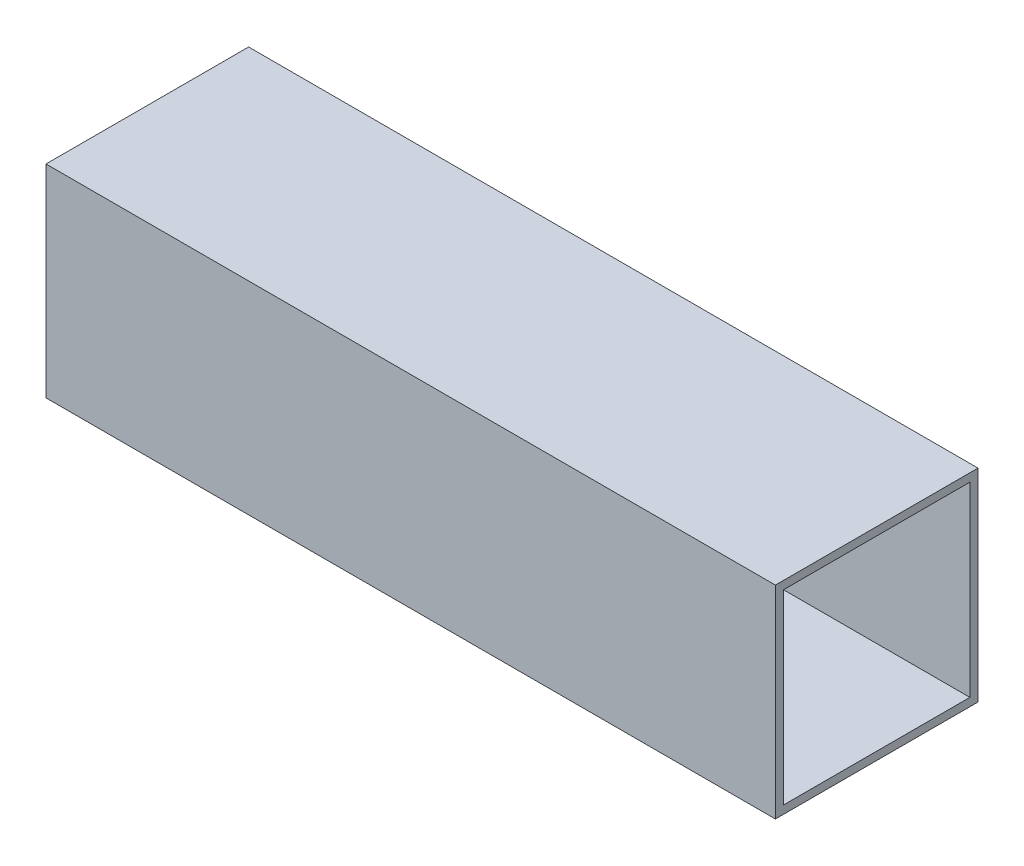
ISO-10303-21;
HEADER;
FILE_DESCRIPTION(('STEP AP214'),'2;1');
FILE_NAME('part.step','',(''),(''),'','','');
FILE_SCHEMA(('AUTOMOTIVE_DESIGN { 1 0 10303 214 1 1 1 1 }'));
ENDSEC;
DATA;
#1=APPLICATION_CONTEXT('core data for automotive mechanical design processes');
#2=APPLICATION_PROTOCOL_DEFINITION('international standard','automotive_design',2000,#1);
#3=PRODUCT_CONTEXT('',#1,'mechanical');
#4=PRODUCT('Part','Part','',(#3));
#5=PRODUCT_RELATED_PRODUCT_CATEGORY('part','',(#4));
#6=PRODUCT_DEFINITION_FORMATION('','',#4);
#7=PRODUCT_DEFINITION_CONTEXT('part definition',#1,'design');
#8=PRODUCT_DEFINITION('design','',#6,#7);
#9=PRODUCT_DEFINITION_SHAPE('','',#8);
#10=(LENGTH_UNIT() NAMED_UNIT(*) SI_UNIT(.MILLI.,.METRE.));
#11=(NAMED_UNIT(*) PLANE_ANGLE_UNIT() SI_UNIT($,.RADIAN.));
#12=(NAMED_UNIT(*) SI_UNIT($,.STERADIAN.) SOLID_ANGLE_UNIT());
#13=UNCERTAINTY_MEASURE_WITH_UNIT(LENGTH_MEASURE(1.E-05),#10,'distance_accuracy_value','');
#14=(GEOMETRIC_REPRESENTATION_CONTEXT(3) GLOBAL_UNCERTAINTY_ASSIGNED_CONTEXT((#13)) GLOBAL_UNIT_ASSIGNED_CONTEXT((#10,
#11,#12)) REPRESENTATION_CONTEXT('',''));
#15=CARTESIAN_POINT('',(0.,0.,0.));
#16=DIRECTION('',(0.,0.,1.));
#17=DIRECTION('',(1.,0.,0.));
#18=AXIS2_PLACEMENT_3D('',#15,#16,#17);
#19=CARTESIAN_POINT('',(0.,0.,25.));
#20=DIRECTION('',(1.,0.,0.));
#21=DIRECTION('',(0.,1.,0.));
#22=AXIS2_PLACEMENT_3D('',#19,#20,#21);
#23=PLANE('',#22);
#24=DIRECTION('',(0.,-1.,0.));
#25=VECTOR('',#24,1.);
#26=CARTESIAN_POINT('',(0.,0.,0.));
#27=LINE('',#26,#25);
#28=CARTESIAN_POINT('',(0.,0.,0.));
#29=VERTEX_POINT('',#28);
#30=CARTESIAN_POINT('',(0.,-25.,0.));
#31=VERTEX_POINT('',#30);
#32=EDGE_CURVE('E115',#29,#31,#27,.T.);
#33=ORIENTED_EDGE('',*,*,#32,.T.);
#34=DIRECTION('',(0.,0.,-1.));
#35=VECTOR('',#34,1.);
#36=CARTESIAN_POINT('',(0.,-25.,25.));
#37=LINE('',#36,#35);
#38=CARTESIAN_POINT('',(0.,-25.,25.));
#39=VERTEX_POINT('',#38);
#40=EDGE_CURVE('E11',#39,#31,#37,.T.);
#41=ORIENTED_EDGE('',*,*,#40,.F.);
#42=DIRECTION('',(0.,-1.,0.));
#43=VECTOR('',#42,1.);
#44=CARTESIAN_POINT('',(0.,0.,25.));
#45=LINE('',#44,#43);
#46=CARTESIAN_POINT('',(0.,0.,25.));
#47=VERTEX_POINT('',#46);
#48=EDGE_CURVE('E134',#47,#39,#45,.T.);
#49=ORIENTED_EDGE('',*,*,#48,.F.);
#50=DIRECTION('',(0.,0.,-1.));
#51=VECTOR('',#50,1.);
#52=CARTESIAN_POINT('',(0.,0.,25.));
#53=LINE('',#52,#51);
#54=EDGE_CURVE('E144',#47,#29,#53,.T.);
#55=ORIENTED_EDGE('',*,*,#54,.T.);
#56=EDGE_LOOP('',(#33,#41,#49,#55));
#57=FACE_BOUND('',#56,.T.);
#58=DIRECTION('',(0.,0.,-1.));
#59=VECTOR('',#58,1.);
#60=CARTESIAN_POINT('',(0.,-1.,24.));
#61=LINE('',#60,#59);
#62=CARTESIAN_POINT('',(0.,-1.,24.));
#63=VERTEX_POINT('',#62);
#64=CARTESIAN_POINT('',(0.,-1.,0.999999999999988));
#65=VERTEX_POINT('',#64);
#66=EDGE_CURVE('E98',#63,#65,#61,.T.);
#67=ORIENTED_EDGE('',*,*,#66,.F.);
#68=DIRECTION('',(0.,1.,0.));
#69=VECTOR('',#68,1.);
#70=CARTESIAN_POINT('',(0.,-24.,24.));
#71=LINE('',#70,#69);
#72=CARTESIAN_POINT('',(0.,-24.,24.));
#73=VERTEX_POINT('',#72);
#74=EDGE_CURVE('E119',#73,#63,#71,.T.);
#75=ORIENTED_EDGE('',*,*,#74,.F.);
#76=DIRECTION('',(0.,0.,-1.));
#77=VECTOR('',#76,1.);
#78=CARTESIAN_POINT('',(0.,-24.,24.));
#79=LINE('',#78,#77);
#80=CARTESIAN_POINT('',(0.,-24.,0.999999999999988));
#81=VERTEX_POINT('',#80);
#82=EDGE_CURVE('E49',#73,#81,#79,.T.);
#83=ORIENTED_EDGE('',*,*,#82,.T.);
#84=DIRECTION('',(0.,1.,0.));
#85=VECTOR('',#84,1.);
#86=CARTESIAN_POINT('',(0.,-24.,0.999999999999988));
#87=LINE('',#86,#85);
#88=EDGE_CURVE('E107',#81,#65,#87,.T.);
#89=ORIENTED_EDGE('',*,*,#88,.T.);
#90=EDGE_LOOP('',(#67,#75,#83,#89));
#91=FACE_BOUND('',#90,.T.);
#92=ADVANCED_FACE('F35',(#57,#91),#23,.F.);
#93=CARTESIAN_POINT('',(90.,0.,25.));
#94=DIRECTION('',(-1.,0.,0.));
#95=DIRECTION('',(0.,0.,1.));
#96=AXIS2_PLACEMENT_3D('',#93,#94,#95);
#97=PLANE('',#96);
#98=DIRECTION('',(0.,1.,0.));
#99=VECTOR('',#98,1.);
#100=CARTESIAN_POINT('',(90.,0.,0.));
#101=LINE('',#100,#99);
#102=CARTESIAN_POINT('',(90.,-25.,0.));
#103=VERTEX_POINT('',#102);
#104=CARTESIAN_POINT('',(90.,0.,0.));
#105=VERTEX_POINT('',#104);
#106=EDGE_CURVE('E149',#103,#105,#101,.T.);
#107=ORIENTED_EDGE('',*,*,#106,.T.);
#108=DIRECTION('',(0.,0.,-1.));
#109=VECTOR('',#108,1.);
#110=CARTESIAN_POINT('',(90.,0.,25.));
#111=LINE('',#110,#109);
#112=CARTESIAN_POINT('',(90.,0.,25.));
#113=VERTEX_POINT('',#112);
#114=EDGE_CURVE('E154',#113,#105,#111,.T.);
#115=ORIENTED_EDGE('',*,*,#114,.F.);
#116=DIRECTION('',(0.,1.,0.));
#117=VECTOR('',#116,1.);
#118=CARTESIAN_POINT('',(90.,0.,25.));
#119=LINE('',#118,#117);
#120=CARTESIAN_POINT('',(90.,-25.,25.));
#121=VERTEX_POINT('',#120);
#122=EDGE_CURVE('E140',#121,#113,#119,.T.);
#123=ORIENTED_EDGE('',*,*,#122,.F.);
#124=DIRECTION('',(0.,0.,-1.));
#125=VECTOR('',#124,1.);
#126=CARTESIAN_POINT('',(90.,-25.,25.));
#127=LINE('',#126,#125);
#128=EDGE_CURVE('E42',#121,#103,#127,.T.);
#129=ORIENTED_EDGE('',*,*,#128,.T.);
#130=EDGE_LOOP('',(#107,#115,#123,#129));
#131=FACE_BOUND('',#130,.T.);
#132=DIRECTION('',(0.,0.,-1.));
#133=VECTOR('',#132,1.);
#134=CARTESIAN_POINT('',(90.,-1.,24.));
#135=LINE('',#134,#133);
#136=CARTESIAN_POINT('',(90.,-1.,24.));
#137=VERTEX_POINT('',#136);
#138=CARTESIAN_POINT('',(90.,-1.,0.999999999999988));
#139=VERTEX_POINT('',#138);
#140=EDGE_CURVE('E57',#137,#139,#135,.T.);
#141=ORIENTED_EDGE('',*,*,#140,.T.);
#142=DIRECTION('',(0.,1.,0.));
#143=VECTOR('',#142,1.);
#144=CARTESIAN_POINT('',(90.,-24.,0.999999999999988));
#145=LINE('',#144,#143);
#146=CARTESIAN_POINT('',(90.,-24.,0.999999999999988));
#147=VERTEX_POINT('',#146);
#148=EDGE_CURVE('E114',#147,#139,#145,.T.);
#149=ORIENTED_EDGE('',*,*,#148,.F.);
#150=DIRECTION('',(0.,0.,-1.));
#151=VECTOR('',#150,1.);
#152=CARTESIAN_POINT('',(90.,-24.,24.));
#153=LINE('',#152,#151);
#154=CARTESIAN_POINT('',(90.,-24.,24.));
#155=VERTEX_POINT('',#154);
#156=EDGE_CURVE('E125',#155,#147,#153,.T.);
#157=ORIENTED_EDGE('',*,*,#156,.F.);
#158=DIRECTION('',(0.,1.,0.));
#159=VECTOR('',#158,1.);
#160=CARTESIAN_POINT('',(90.,-24.,24.));
#161=LINE('',#160,#159);
#162=EDGE_CURVE('E108',#155,#137,#161,.T.);
#163=ORIENTED_EDGE('',*,*,#162,.T.);
#164=EDGE_LOOP('',(#141,#149,#157,#163));
#165=FACE_BOUND('',#164,.T.);
#166=ADVANCED_FACE('F161',(#131,#165),#97,.F.);
#167=CARTESIAN_POINT('',(0.,-25.,25.));
#168=DIRECTION('',(0.,1.,0.));
#169=DIRECTION('',(0.,0.,1.));
#170=AXIS2_PLACEMENT_3D('',#167,#168,#169);
#171=PLANE('',#170);
#172=DIRECTION('',(1.,0.,0.));
#173=VECTOR('',#172,1.);
#174=CARTESIAN_POINT('',(0.,-25.,0.));
#175=LINE('',#174,#173);
#176=EDGE_CURVE('E147',#31,#103,#175,.T.);
#177=ORIENTED_EDGE('',*,*,#176,.T.);
#178=ORIENTED_EDGE('',*,*,#128,.F.);
#179=DIRECTION('',(1.,0.,0.));
#180=VECTOR('',#179,1.);
#181=CARTESIAN_POINT('',(0.,-25.,25.));
#182=LINE('',#181,#180);
#183=EDGE_CURVE('E137',#39,#121,#182,.T.);
#184=ORIENTED_EDGE('',*,*,#183,.F.);
#185=ORIENTED_EDGE('',*,*,#40,.T.);
#186=EDGE_LOOP('',(#177,#178,#184,#185));
#187=FACE_BOUND('',#186,.T.);
#188=ADVANCED_FACE('F178',(#187),#171,.F.);
#189=CARTESIAN_POINT('',(0.,0.,25.));
#190=DIRECTION('',(0.,-1.,0.));
#191=DIRECTION('',(0.,0.,-1.));
#192=AXIS2_PLACEMENT_3D('',#189,#190,#191);
#193=PLANE('',#192);
#194=DIRECTION('',(-1.,0.,0.));
#195=VECTOR('',#194,1.);
#196=CARTESIAN_POINT('',(0.,0.,0.));
#197=LINE('',#196,#195);
#198=EDGE_CURVE('E138',#105,#29,#197,.T.);
#199=ORIENTED_EDGE('',*,*,#198,.T.);
#200=ORIENTED_EDGE('',*,*,#54,.F.);
#201=DIRECTION('',(-1.,0.,0.));
#202=VECTOR('',#201,1.);
#203=CARTESIAN_POINT('',(0.,0.,25.));
#204=LINE('',#203,#202);
#205=EDGE_CURVE('E142',#113,#47,#204,.T.);
#206=ORIENTED_EDGE('',*,*,#205,.F.);
#207=ORIENTED_EDGE('',*,*,#114,.T.);
#208=EDGE_LOOP('',(#199,#200,#206,#207));
#209=FACE_BOUND('',#208,.T.);
#210=ADVANCED_FACE('F171',(#209),#193,.F.);
#211=CARTESIAN_POINT('',(0.,0.,25.));
#212=DIRECTION('',(0.,0.,1.));
#213=DIRECTION('',(1.,0.,0.));
#214=AXIS2_PLACEMENT_3D('',#211,#212,#213);
#215=PLANE('',#214);
#216=ORIENTED_EDGE('',*,*,#48,.T.);
#217=ORIENTED_EDGE('',*,*,#183,.T.);
#218=ORIENTED_EDGE('',*,*,#122,.T.);
#219=ORIENTED_EDGE('',*,*,#205,.T.);
#220=EDGE_LOOP('',(#216,#217,#218,#219));
#221=FACE_BOUND('',#220,.T.);
#222=ADVANCED_FACE('F177',(#221),#215,.T.);
#223=CARTESIAN_POINT('',(0.,0.,0.));
#224=DIRECTION('',(0.,0.,1.));
#225=DIRECTION('',(1.,0.,0.));
#226=AXIS2_PLACEMENT_3D('',#223,#224,#225);
#227=PLANE('',#226);
#228=ORIENTED_EDGE('',*,*,#32,.F.);
#229=ORIENTED_EDGE('',*,*,#198,.F.);
#230=ORIENTED_EDGE('',*,*,#106,.F.);
#231=ORIENTED_EDGE('',*,*,#176,.F.);
#232=EDGE_LOOP('',(#228,#229,#230,#231));
#233=FACE_BOUND('',#232,.T.);
#234=ADVANCED_FACE('F168',(#233),#227,.F.);
#235=CARTESIAN_POINT('',(0.,-1.,24.));
#236=DIRECTION('',(0.,-1.,0.));
#237=DIRECTION('',(0.,0.,-1.));
#238=AXIS2_PLACEMENT_3D('',#235,#236,#237);
#239=PLANE('',#238);
#240=ORIENTED_EDGE('',*,*,#140,.F.);
#241=DIRECTION('',(1.,0.,0.));
#242=VECTOR('',#241,1.);
#243=CARTESIAN_POINT('',(0.,-1.,24.));
#244=LINE('',#243,#242);
#245=EDGE_CURVE('E103',#63,#137,#244,.T.);
#246=ORIENTED_EDGE('',*,*,#245,.F.);
#247=ORIENTED_EDGE('',*,*,#66,.T.);
#248=DIRECTION('',(1.,0.,0.));
#249=VECTOR('',#248,1.);
#250=CARTESIAN_POINT('',(0.,-1.,0.999999999999988));
#251=LINE('',#250,#249);
#252=EDGE_CURVE('E101',#65,#139,#251,.T.);
#253=ORIENTED_EDGE('',*,*,#252,.T.);
#254=EDGE_LOOP('',(#240,#246,#247,#253));
#255=FACE_BOUND('',#254,.T.);
#256=ADVANCED_FACE('F100',(#255),#239,.T.);
#257=CARTESIAN_POINT('',(0.,-24.,0.999999999999988));
#258=DIRECTION('',(0.,0.,-1.));
#259=DIRECTION('',(-1.,0.,0.));
#260=AXIS2_PLACEMENT_3D('',#257,#258,#259);
#261=PLANE('',#260);
#262=ORIENTED_EDGE('',*,*,#148,.T.);
#263=ORIENTED_EDGE('',*,*,#252,.F.);
#264=ORIENTED_EDGE('',*,*,#88,.F.);
#265=DIRECTION('',(1.,0.,0.));
#266=VECTOR('',#265,1.);
#267=CARTESIAN_POINT('',(0.,-24.,0.999999999999988));
#268=LINE('',#267,#266);
#269=EDGE_CURVE('E116',#81,#147,#268,.T.);
#270=ORIENTED_EDGE('',*,*,#269,.T.);
#271=EDGE_LOOP('',(#262,#263,#264,#270));
#272=FACE_BOUND('',#271,.T.);
#273=ADVANCED_FACE('F112',(#272),#261,.F.);
#274=CARTESIAN_POINT('',(0.,-24.,24.));
#275=DIRECTION('',(0.,-1.,0.));
#276=DIRECTION('',(0.,0.,-1.));
#277=AXIS2_PLACEMENT_3D('',#274,#275,#276);
#278=PLANE('',#277);
#279=ORIENTED_EDGE('',*,*,#156,.T.);
#280=ORIENTED_EDGE('',*,*,#269,.F.);
#281=ORIENTED_EDGE('',*,*,#82,.F.);
#282=DIRECTION('',(1.,0.,0.));
#283=VECTOR('',#282,1.);
#284=CARTESIAN_POINT('',(0.,-24.,24.));
#285=LINE('',#284,#283);
#286=EDGE_CURVE('E131',#73,#155,#285,.T.);
#287=ORIENTED_EDGE('',*,*,#286,.T.);
#288=EDGE_LOOP('',(#279,#280,#281,#287));
#289=FACE_BOUND('',#288,.T.);
#290=ADVANCED_FACE('F213',(#289),#278,.F.);
#291=CARTESIAN_POINT('',(0.,-24.,24.));
#292=DIRECTION('',(0.,0.,-1.));
#293=DIRECTION('',(-1.,0.,0.));
#294=AXIS2_PLACEMENT_3D('',#291,#292,#293);
#295=PLANE('',#294);
#296=ORIENTED_EDGE('',*,*,#162,.F.);
#297=ORIENTED_EDGE('',*,*,#286,.F.);
#298=ORIENTED_EDGE('',*,*,#74,.T.);
#299=ORIENTED_EDGE('',*,*,#245,.T.);
#300=EDGE_LOOP('',(#296,#297,#298,#299));
#301=FACE_BOUND('',#300,.T.);
#302=ADVANCED_FACE('F222',(#301),#295,.T.);
#303=CLOSED_SHELL('',(#92,#166,#188,#210,#222,#234,#256,#273,#290,#302));
#304=MANIFOLD_SOLID_BREP('B2',#303);
#305=ADVANCED_BREP_SHAPE_REPRESENTATION('',(#18,#304),#14);
#306=SHAPE_DEFINITION_REPRESENTATION(#9,#305);
ENDSEC;
END-ISO-10303-21;
